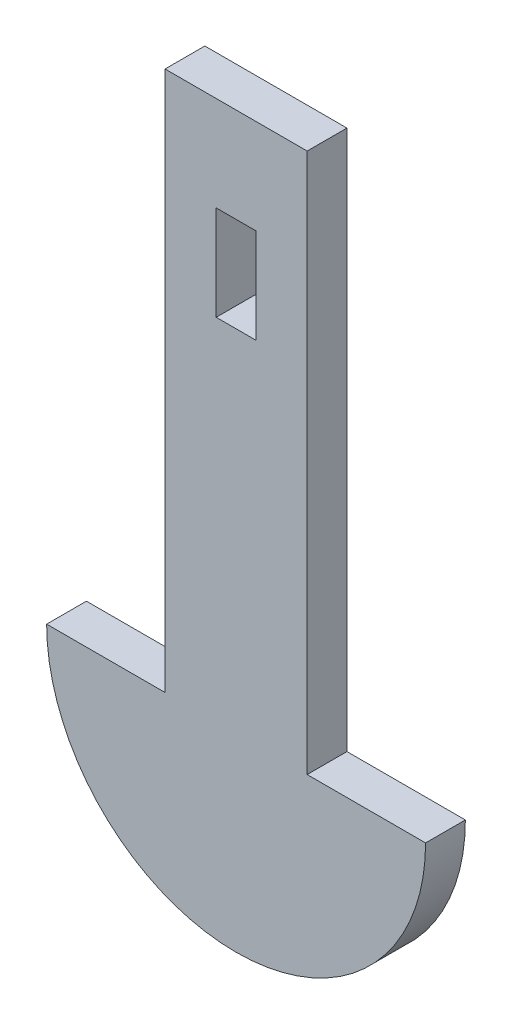
ISO-10303-21;
HEADER;
FILE_DESCRIPTION(('STEP AP214'),'2;1');
FILE_NAME('part.step','',(''),(''),'','','');
FILE_SCHEMA(('AUTOMOTIVE_DESIGN { 1 0 10303 214 1 1 1 1 }'));
ENDSEC;
DATA;
#1=APPLICATION_CONTEXT('core data for automotive mechanical design processes');
#2=APPLICATION_PROTOCOL_DEFINITION('international standard','automotive_design',2000,#1);
#3=PRODUCT_CONTEXT('',#1,'mechanical');
#4=PRODUCT('Part','Part','',(#3));
#5=PRODUCT_RELATED_PRODUCT_CATEGORY('part','',(#4));
#6=PRODUCT_DEFINITION_FORMATION('','',#4);
#7=PRODUCT_DEFINITION_CONTEXT('part definition',#1,'design');
#8=PRODUCT_DEFINITION('design','',#6,#7);
#9=PRODUCT_DEFINITION_SHAPE('','',#8);
#10=(LENGTH_UNIT() NAMED_UNIT(*) SI_UNIT(.MILLI.,.METRE.));
#11=(NAMED_UNIT(*) PLANE_ANGLE_UNIT() SI_UNIT($,.RADIAN.));
#12=(NAMED_UNIT(*) SI_UNIT($,.STERADIAN.) SOLID_ANGLE_UNIT());
#13=UNCERTAINTY_MEASURE_WITH_UNIT(LENGTH_MEASURE(1.E-05),#10,'distance_accuracy_value','');
#14=(GEOMETRIC_REPRESENTATION_CONTEXT(3) GLOBAL_UNCERTAINTY_ASSIGNED_CONTEXT((#13)) GLOBAL_UNIT_ASSIGNED_CONTEXT((#10,
#11,#12)) REPRESENTATION_CONTEXT('',''));
#15=CARTESIAN_POINT('',(0.,0.,0.));
#16=DIRECTION('',(0.,0.,1.));
#17=DIRECTION('',(1.,0.,0.));
#18=AXIS2_PLACEMENT_3D('',#15,#16,#17);
#19=CARTESIAN_POINT('',(0.,0.,5.334));
#20=DIRECTION('',(0.,0.,1.));
#21=DIRECTION('',(1.,0.,0.));
#22=AXIS2_PLACEMENT_3D('',#19,#20,#21);
#23=PLANE('',#22);
#24=CARTESIAN_POINT('',(0.,0.,5.334));
#25=DIRECTION('',(0.,0.,1.));
#26=DIRECTION('',(1.,0.,0.));
#27=AXIS2_PLACEMENT_3D('',#24,#25,#26);
#28=CIRCLE('',#27,25.4);
#29=CARTESIAN_POINT('',(-25.4,0.,5.334));
#30=VERTEX_POINT('',#29);
#31=CARTESIAN_POINT('',(25.4,0.,5.334));
#32=VERTEX_POINT('',#31);
#33=EDGE_CURVE('E148',#30,#32,#28,.T.);
#34=ORIENTED_EDGE('',*,*,#33,.T.);
#35=DIRECTION('',(-1.,0.,0.));
#36=VECTOR('',#35,1.);
#37=CARTESIAN_POINT('',(9.525,0.,5.334));
#38=LINE('',#37,#36);
#39=CARTESIAN_POINT('',(9.525,0.,5.334));
#40=VERTEX_POINT('',#39);
#41=EDGE_CURVE('E151',#32,#40,#38,.T.);
#42=ORIENTED_EDGE('',*,*,#41,.T.);
#43=DIRECTION('',(0.,1.,0.));
#44=VECTOR('',#43,1.);
#45=CARTESIAN_POINT('',(9.525,0.,5.334));
#46=LINE('',#45,#44);
#47=CARTESIAN_POINT('',(9.525,72.39,5.334));
#48=VERTEX_POINT('',#47);
#49=EDGE_CURVE('E154',#40,#48,#46,.T.);
#50=ORIENTED_EDGE('',*,*,#49,.T.);
#51=DIRECTION('',(-1.,0.,0.));
#52=VECTOR('',#51,1.);
#53=CARTESIAN_POINT('',(-9.525,72.39,5.334));
#54=LINE('',#53,#52);
#55=CARTESIAN_POINT('',(-9.525,72.39,5.334));
#56=VERTEX_POINT('',#55);
#57=EDGE_CURVE('E156',#48,#56,#54,.T.);
#58=ORIENTED_EDGE('',*,*,#57,.T.);
#59=DIRECTION('',(0.,-1.,0.));
#60=VECTOR('',#59,1.);
#61=CARTESIAN_POINT('',(-9.525,0.,5.334));
#62=LINE('',#61,#60);
#63=CARTESIAN_POINT('',(-9.525,0.,5.334));
#64=VERTEX_POINT('',#63);
#65=EDGE_CURVE('E158',#56,#64,#62,.T.);
#66=ORIENTED_EDGE('',*,*,#65,.T.);
#67=DIRECTION('',(-1.,0.,0.));
#68=VECTOR('',#67,1.);
#69=CARTESIAN_POINT('',(-9.525,0.,5.334));
#70=LINE('',#69,#68);
#71=EDGE_CURVE('E160',#64,#30,#70,.T.);
#72=ORIENTED_EDGE('',*,*,#71,.T.);
#73=EDGE_LOOP('',(#34,#42,#50,#58,#66,#72));
#74=FACE_BOUND('',#73,.T.);
#75=DIRECTION('',(1.,0.,0.));
#76=VECTOR('',#75,1.);
#77=CARTESIAN_POINT('',(-2.667,46.99,5.334));
#78=LINE('',#77,#76);
#79=CARTESIAN_POINT('',(-2.667,46.99,5.334));
#80=VERTEX_POINT('',#79);
#81=CARTESIAN_POINT('',(2.667,46.99,5.334));
#82=VERTEX_POINT('',#81);
#83=EDGE_CURVE('E120',#80,#82,#78,.T.);
#84=ORIENTED_EDGE('',*,*,#83,.F.);
#85=DIRECTION('',(0.,-1.,0.));
#86=VECTOR('',#85,1.);
#87=CARTESIAN_POINT('',(-2.667,59.69,5.334));
#88=LINE('',#87,#86);
#89=CARTESIAN_POINT('',(-2.667,59.69,5.334));
#90=VERTEX_POINT('',#89);
#91=EDGE_CURVE('E112',#90,#80,#88,.T.);
#92=ORIENTED_EDGE('',*,*,#91,.F.);
#93=DIRECTION('',(-1.,0.,0.));
#94=VECTOR('',#93,1.);
#95=CARTESIAN_POINT('',(-2.667,59.69,5.334));
#96=LINE('',#95,#94);
#97=CARTESIAN_POINT('',(2.667,59.69,5.334));
#98=VERTEX_POINT('',#97);
#99=EDGE_CURVE('E134',#98,#90,#96,.T.);
#100=ORIENTED_EDGE('',*,*,#99,.F.);
#101=DIRECTION('',(0.,1.,0.));
#102=VECTOR('',#101,1.);
#103=CARTESIAN_POINT('',(2.667,59.69,5.334));
#104=LINE('',#103,#102);
#105=EDGE_CURVE('E132',#82,#98,#104,.T.);
#106=ORIENTED_EDGE('',*,*,#105,.F.);
#107=EDGE_LOOP('',(#84,#92,#100,#106));
#108=FACE_BOUND('',#107,.T.);
#109=ADVANCED_FACE('F35',(#74,#108),#23,.T.);
#110=CARTESIAN_POINT('',(0.,0.,0.));
#111=DIRECTION('',(0.,0.,1.));
#112=DIRECTION('',(1.,0.,0.));
#113=AXIS2_PLACEMENT_3D('',#110,#111,#112);
#114=PLANE('',#113);
#115=CARTESIAN_POINT('',(0.,0.,0.));
#116=DIRECTION('',(0.,0.,1.));
#117=DIRECTION('',(1.,0.,0.));
#118=AXIS2_PLACEMENT_3D('',#115,#116,#117);
#119=CIRCLE('',#118,25.4);
#120=CARTESIAN_POINT('',(-25.4,0.,0.));
#121=VERTEX_POINT('',#120);
#122=CARTESIAN_POINT('',(25.4,0.,0.));
#123=VERTEX_POINT('',#122);
#124=EDGE_CURVE('E128',#121,#123,#119,.T.);
#125=ORIENTED_EDGE('',*,*,#124,.F.);
#126=DIRECTION('',(-1.,0.,0.));
#127=VECTOR('',#126,1.);
#128=CARTESIAN_POINT('',(-9.525,0.,0.));
#129=LINE('',#128,#127);
#130=CARTESIAN_POINT('',(-9.525,0.,0.));
#131=VERTEX_POINT('',#130);
#132=EDGE_CURVE('E152',#131,#121,#129,.T.);
#133=ORIENTED_EDGE('',*,*,#132,.F.);
#134=DIRECTION('',(0.,-1.,0.));
#135=VECTOR('',#134,1.);
#136=CARTESIAN_POINT('',(-9.525,0.,0.));
#137=LINE('',#136,#135);
#138=CARTESIAN_POINT('',(-9.525,72.39,0.));
#139=VERTEX_POINT('',#138);
#140=EDGE_CURVE('E171',#139,#131,#137,.T.);
#141=ORIENTED_EDGE('',*,*,#140,.F.);
#142=DIRECTION('',(-1.,0.,0.));
#143=VECTOR('',#142,1.);
#144=CARTESIAN_POINT('',(-9.525,72.39,0.));
#145=LINE('',#144,#143);
#146=CARTESIAN_POINT('',(9.525,72.39,0.));
#147=VERTEX_POINT('',#146);
#148=EDGE_CURVE('E169',#147,#139,#145,.T.);
#149=ORIENTED_EDGE('',*,*,#148,.F.);
#150=DIRECTION('',(0.,1.,0.));
#151=VECTOR('',#150,1.);
#152=CARTESIAN_POINT('',(9.525,0.,0.));
#153=LINE('',#152,#151);
#154=CARTESIAN_POINT('',(9.525,0.,0.));
#155=VERTEX_POINT('',#154);
#156=EDGE_CURVE('E167',#155,#147,#153,.T.);
#157=ORIENTED_EDGE('',*,*,#156,.F.);
#158=DIRECTION('',(-1.,0.,0.));
#159=VECTOR('',#158,1.);
#160=CARTESIAN_POINT('',(9.525,0.,0.));
#161=LINE('',#160,#159);
#162=EDGE_CURVE('E165',#123,#155,#161,.T.);
#163=ORIENTED_EDGE('',*,*,#162,.F.);
#164=EDGE_LOOP('',(#125,#133,#141,#149,#157,#163));
#165=FACE_BOUND('',#164,.T.);
#166=DIRECTION('',(0.,-1.,0.));
#167=VECTOR('',#166,1.);
#168=CARTESIAN_POINT('',(-2.667,59.69,0.));
#169=LINE('',#168,#167);
#170=CARTESIAN_POINT('',(-2.667,59.69,0.));
#171=VERTEX_POINT('',#170);
#172=CARTESIAN_POINT('',(-2.667,46.99,0.));
#173=VERTEX_POINT('',#172);
#174=EDGE_CURVE('E58',#171,#173,#169,.T.);
#175=ORIENTED_EDGE('',*,*,#174,.T.);
#176=DIRECTION('',(1.,0.,0.));
#177=VECTOR('',#176,1.);
#178=CARTESIAN_POINT('',(-2.667,46.99,0.));
#179=LINE('',#178,#177);
#180=CARTESIAN_POINT('',(2.667,46.99,0.));
#181=VERTEX_POINT('',#180);
#182=EDGE_CURVE('E127',#173,#181,#179,.T.);
#183=ORIENTED_EDGE('',*,*,#182,.T.);
#184=DIRECTION('',(0.,1.,0.));
#185=VECTOR('',#184,1.);
#186=CARTESIAN_POINT('',(2.667,59.69,0.));
#187=LINE('',#186,#185);
#188=CARTESIAN_POINT('',(2.667,59.69,0.));
#189=VERTEX_POINT('',#188);
#190=EDGE_CURVE('E140',#181,#189,#187,.T.);
#191=ORIENTED_EDGE('',*,*,#190,.T.);
#192=DIRECTION('',(-1.,0.,0.));
#193=VECTOR('',#192,1.);
#194=CARTESIAN_POINT('',(-2.667,59.69,0.));
#195=LINE('',#194,#193);
#196=EDGE_CURVE('E121',#189,#171,#195,.T.);
#197=ORIENTED_EDGE('',*,*,#196,.T.);
#198=EDGE_LOOP('',(#175,#183,#191,#197));
#199=FACE_BOUND('',#198,.T.);
#200=ADVANCED_FACE('F195',(#165,#199),#114,.F.);
#201=CARTESIAN_POINT('',(0.,0.,5.334));
#202=DIRECTION('',(0.,0.,-1.));
#203=DIRECTION('',(-1.,0.,0.));
#204=AXIS2_PLACEMENT_3D('',#201,#202,#203);
#205=CYLINDRICAL_SURFACE('',#204,25.4);
#206=ORIENTED_EDGE('',*,*,#124,.T.);
#207=DIRECTION('',(0.,0.,-1.));
#208=VECTOR('',#207,1.);
#209=CARTESIAN_POINT('',(25.4,0.,5.334));
#210=LINE('',#209,#208);
#211=EDGE_CURVE('E11',#32,#123,#210,.T.);
#212=ORIENTED_EDGE('',*,*,#211,.F.);
#213=ORIENTED_EDGE('',*,*,#33,.F.);
#214=DIRECTION('',(0.,0.,-1.));
#215=VECTOR('',#214,1.);
#216=CARTESIAN_POINT('',(-25.4,0.,5.334));
#217=LINE('',#216,#215);
#218=EDGE_CURVE('E162',#30,#121,#217,.T.);
#219=ORIENTED_EDGE('',*,*,#218,.T.);
#220=EDGE_LOOP('',(#206,#212,#213,#219));
#221=FACE_BOUND('',#220,.T.);
#222=ADVANCED_FACE('F37',(#221),#205,.T.);
#223=CARTESIAN_POINT('',(9.525,0.,5.334));
#224=DIRECTION('',(0.,-1.,0.));
#225=DIRECTION('',(1.,0.,0.));
#226=AXIS2_PLACEMENT_3D('',#223,#224,#225);
#227=PLANE('',#226);
#228=ORIENTED_EDGE('',*,*,#162,.T.);
#229=DIRECTION('',(0.,0.,-1.));
#230=VECTOR('',#229,1.);
#231=CARTESIAN_POINT('',(9.525,0.,5.334));
#232=LINE('',#231,#230);
#233=EDGE_CURVE('E43',#40,#155,#232,.T.);
#234=ORIENTED_EDGE('',*,*,#233,.F.);
#235=ORIENTED_EDGE('',*,*,#41,.F.);
#236=ORIENTED_EDGE('',*,*,#211,.T.);
#237=EDGE_LOOP('',(#228,#234,#235,#236));
#238=FACE_BOUND('',#237,.T.);
#239=ADVANCED_FACE('F212',(#238),#227,.F.);
#240=CARTESIAN_POINT('',(9.525,0.,5.334));
#241=DIRECTION('',(-1.,0.,0.));
#242=DIRECTION('',(0.,0.,1.));
#243=AXIS2_PLACEMENT_3D('',#240,#241,#242);
#244=PLANE('',#243);
#245=ORIENTED_EDGE('',*,*,#156,.T.);
#246=DIRECTION('',(0.,0.,-1.));
#247=VECTOR('',#246,1.);
#248=CARTESIAN_POINT('',(9.525,72.39,5.334));
#249=LINE('',#248,#247);
#250=EDGE_CURVE('E182',#48,#147,#249,.T.);
#251=ORIENTED_EDGE('',*,*,#250,.F.);
#252=ORIENTED_EDGE('',*,*,#49,.F.);
#253=ORIENTED_EDGE('',*,*,#233,.T.);
#254=EDGE_LOOP('',(#245,#251,#252,#253));
#255=FACE_BOUND('',#254,.T.);
#256=ADVANCED_FACE('F189',(#255),#244,.F.);
#257=CARTESIAN_POINT('',(-9.525,72.39,5.334));
#258=DIRECTION('',(0.,-1.,0.));
#259=DIRECTION('',(0.,0.,-1.));
#260=AXIS2_PLACEMENT_3D('',#257,#258,#259);
#261=PLANE('',#260);
#262=ORIENTED_EDGE('',*,*,#148,.T.);
#263=DIRECTION('',(0.,0.,-1.));
#264=VECTOR('',#263,1.);
#265=CARTESIAN_POINT('',(-9.525,72.39,5.334));
#266=LINE('',#265,#264);
#267=EDGE_CURVE('E179',#56,#139,#266,.T.);
#268=ORIENTED_EDGE('',*,*,#267,.F.);
#269=ORIENTED_EDGE('',*,*,#57,.F.);
#270=ORIENTED_EDGE('',*,*,#250,.T.);
#271=EDGE_LOOP('',(#262,#268,#269,#270));
#272=FACE_BOUND('',#271,.T.);
#273=ADVANCED_FACE('F201',(#272),#261,.F.);
#274=CARTESIAN_POINT('',(-9.525,0.,5.334));
#275=DIRECTION('',(1.,0.,0.));
#276=DIRECTION('',(0.,0.,-1.));
#277=AXIS2_PLACEMENT_3D('',#274,#275,#276);
#278=PLANE('',#277);
#279=ORIENTED_EDGE('',*,*,#140,.T.);
#280=DIRECTION('',(0.,0.,-1.));
#281=VECTOR('',#280,1.);
#282=CARTESIAN_POINT('',(-9.525,0.,5.334));
#283=LINE('',#282,#281);
#284=EDGE_CURVE('E176',#64,#131,#283,.T.);
#285=ORIENTED_EDGE('',*,*,#284,.F.);
#286=ORIENTED_EDGE('',*,*,#65,.F.);
#287=ORIENTED_EDGE('',*,*,#267,.T.);
#288=EDGE_LOOP('',(#279,#285,#286,#287));
#289=FACE_BOUND('',#288,.T.);
#290=ADVANCED_FACE('F205',(#289),#278,.F.);
#291=CARTESIAN_POINT('',(-9.525,0.,5.334));
#292=DIRECTION('',(0.,-1.,0.));
#293=DIRECTION('',(0.,0.,-1.));
#294=AXIS2_PLACEMENT_3D('',#291,#292,#293);
#295=PLANE('',#294);
#296=ORIENTED_EDGE('',*,*,#132,.T.);
#297=ORIENTED_EDGE('',*,*,#218,.F.);
#298=ORIENTED_EDGE('',*,*,#71,.F.);
#299=ORIENTED_EDGE('',*,*,#284,.T.);
#300=EDGE_LOOP('',(#296,#297,#298,#299));
#301=FACE_BOUND('',#300,.T.);
#302=ADVANCED_FACE('F215',(#301),#295,.F.);
#303=CARTESIAN_POINT('',(-2.667,59.69,5.334));
#304=DIRECTION('',(1.,0.,0.));
#305=DIRECTION('',(0.,1.,0.));
#306=AXIS2_PLACEMENT_3D('',#303,#304,#305);
#307=PLANE('',#306);
#308=ORIENTED_EDGE('',*,*,#174,.F.);
#309=DIRECTION('',(0.,0.,-1.));
#310=VECTOR('',#309,1.);
#311=CARTESIAN_POINT('',(-2.667,59.69,5.334));
#312=LINE('',#311,#310);
#313=EDGE_CURVE('E116',#90,#171,#312,.T.);
#314=ORIENTED_EDGE('',*,*,#313,.F.);
#315=ORIENTED_EDGE('',*,*,#91,.T.);
#316=DIRECTION('',(0.,0.,-1.));
#317=VECTOR('',#316,1.);
#318=CARTESIAN_POINT('',(-2.667,46.99,5.334));
#319=LINE('',#318,#317);
#320=EDGE_CURVE('E115',#80,#173,#319,.T.);
#321=ORIENTED_EDGE('',*,*,#320,.T.);
#322=EDGE_LOOP('',(#308,#314,#315,#321));
#323=FACE_BOUND('',#322,.T.);
#324=ADVANCED_FACE('F114',(#323),#307,.T.);
#325=CARTESIAN_POINT('',(-2.667,46.99,5.334));
#326=DIRECTION('',(0.,1.,0.));
#327=DIRECTION('',(0.,0.,1.));
#328=AXIS2_PLACEMENT_3D('',#325,#326,#327);
#329=PLANE('',#328);
#330=ORIENTED_EDGE('',*,*,#182,.F.);
#331=ORIENTED_EDGE('',*,*,#320,.F.);
#332=ORIENTED_EDGE('',*,*,#83,.T.);
#333=DIRECTION('',(0.,0.,-1.));
#334=VECTOR('',#333,1.);
#335=CARTESIAN_POINT('',(2.667,46.99,5.334));
#336=LINE('',#335,#334);
#337=EDGE_CURVE('E129',#82,#181,#336,.T.);
#338=ORIENTED_EDGE('',*,*,#337,.T.);
#339=EDGE_LOOP('',(#330,#331,#332,#338));
#340=FACE_BOUND('',#339,.T.);
#341=ADVANCED_FACE('F124',(#340),#329,.T.);
#342=CARTESIAN_POINT('',(2.667,59.69,5.334));
#343=DIRECTION('',(-1.,0.,0.));
#344=DIRECTION('',(0.,-1.,0.));
#345=AXIS2_PLACEMENT_3D('',#342,#343,#344);
#346=PLANE('',#345);
#347=ORIENTED_EDGE('',*,*,#190,.F.);
#348=ORIENTED_EDGE('',*,*,#337,.F.);
#349=ORIENTED_EDGE('',*,*,#105,.T.);
#350=DIRECTION('',(0.,0.,-1.));
#351=VECTOR('',#350,1.);
#352=CARTESIAN_POINT('',(2.667,59.69,5.334));
#353=LINE('',#352,#351);
#354=EDGE_CURVE('E50',#98,#189,#353,.T.);
#355=ORIENTED_EDGE('',*,*,#354,.T.);
#356=EDGE_LOOP('',(#347,#348,#349,#355));
#357=FACE_BOUND('',#356,.T.);
#358=ADVANCED_FACE('F233',(#357),#346,.T.);
#359=CARTESIAN_POINT('',(-2.667,59.69,5.334));
#360=DIRECTION('',(0.,-1.,0.));
#361=DIRECTION('',(0.,0.,-1.));
#362=AXIS2_PLACEMENT_3D('',#359,#360,#361);
#363=PLANE('',#362);
#364=ORIENTED_EDGE('',*,*,#196,.F.);
#365=ORIENTED_EDGE('',*,*,#354,.F.);
#366=ORIENTED_EDGE('',*,*,#99,.T.);
#367=ORIENTED_EDGE('',*,*,#313,.T.);
#368=EDGE_LOOP('',(#364,#365,#366,#367));
#369=FACE_BOUND('',#368,.T.);
#370=ADVANCED_FACE('F236',(#369),#363,.T.);
#371=CLOSED_SHELL('',(#109,#200,#222,#239,#256,#273,#290,#302,#324,#341,#358,#370));
#372=MANIFOLD_SOLID_BREP('B2',#371);
#373=ADVANCED_BREP_SHAPE_REPRESENTATION('',(#18,#372),#14);
#374=SHAPE_DEFINITION_REPRESENTATION(#9,#373);
ENDSEC;
END-ISO-10303-21;
